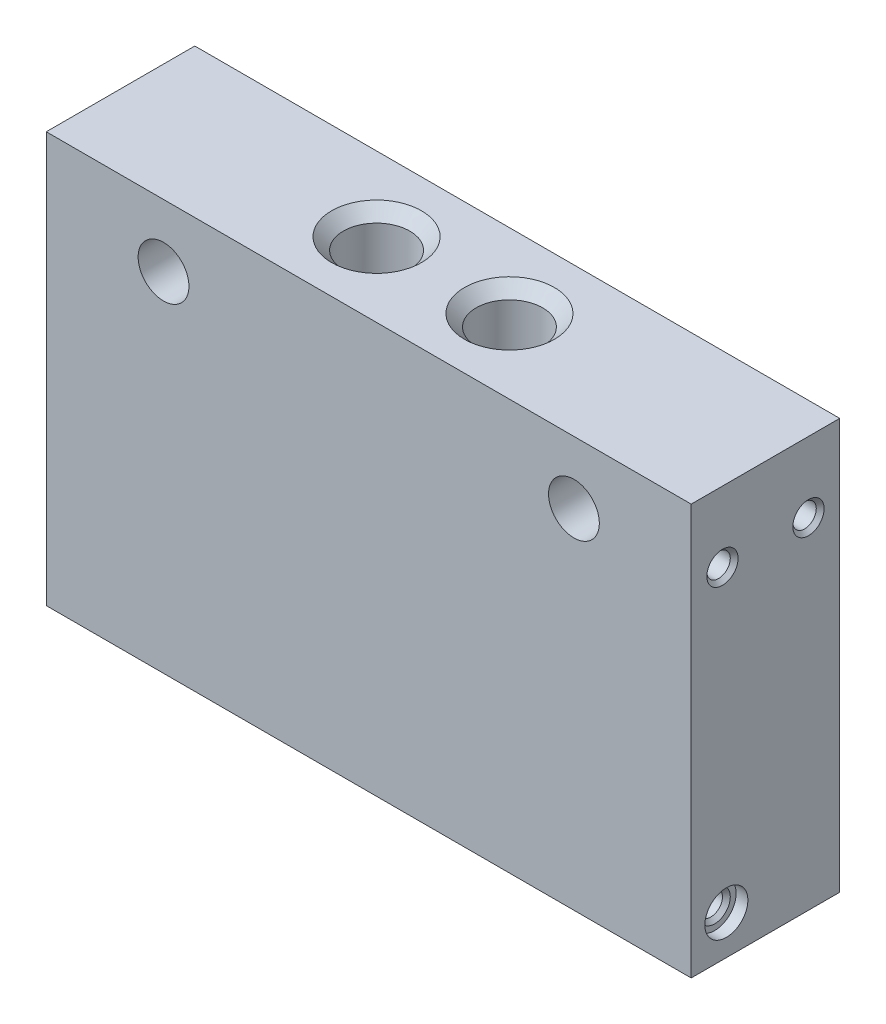
ISO-10303-21;
HEADER;
FILE_DESCRIPTION(('STEP AP214'),'2;1');
FILE_NAME('part.step','',(''),(''),'','','');
FILE_SCHEMA(('AUTOMOTIVE_DESIGN { 1 0 10303 214 1 1 1 1 }'));
ENDSEC;
DATA;
#1=APPLICATION_CONTEXT('core data for automotive mechanical design processes');
#2=APPLICATION_PROTOCOL_DEFINITION('international standard','automotive_design',2000,#1);
#3=PRODUCT_CONTEXT('',#1,'mechanical');
#4=PRODUCT('Part','Part','',(#3));
#5=PRODUCT_RELATED_PRODUCT_CATEGORY('part','',(#4));
#6=PRODUCT_DEFINITION_FORMATION('','',#4);
#7=PRODUCT_DEFINITION_CONTEXT('part definition',#1,'design');
#8=PRODUCT_DEFINITION('design','',#6,#7);
#9=PRODUCT_DEFINITION_SHAPE('','',#8);
#10=(LENGTH_UNIT() NAMED_UNIT(*) SI_UNIT(.MILLI.,.METRE.));
#11=(NAMED_UNIT(*) PLANE_ANGLE_UNIT() SI_UNIT($,.RADIAN.));
#12=(NAMED_UNIT(*) SI_UNIT($,.STERADIAN.) SOLID_ANGLE_UNIT());
#13=UNCERTAINTY_MEASURE_WITH_UNIT(LENGTH_MEASURE(1.E-05),#10,'distance_accuracy_value','');
#14=(GEOMETRIC_REPRESENTATION_CONTEXT(3) GLOBAL_UNCERTAINTY_ASSIGNED_CONTEXT((#13)) GLOBAL_UNIT_ASSIGNED_CONTEXT((#10,
#11,#12)) REPRESENTATION_CONTEXT('',''));
#15=CARTESIAN_POINT('',(0.,0.,0.));
#16=DIRECTION('',(0.,0.,1.));
#17=DIRECTION('',(1.,0.,0.));
#18=AXIS2_PLACEMENT_3D('',#15,#16,#17);
#19=CARTESIAN_POINT('',(41.91,26.67,-9.652));
#20=DIRECTION('',(-1.,0.,0.));
#21=DIRECTION('',(0.,0.,1.));
#22=AXIS2_PLACEMENT_3D('',#19,#20,#21);
#23=PLANE('',#22);
#24=CARTESIAN_POINT('',(41.91,22.098,-7.61999999999999));
#25=DIRECTION('',(-1.,0.,0.));
#26=DIRECTION('',(0.,0.,1.));
#27=AXIS2_PLACEMENT_3D('',#24,#25,#26);
#28=CIRCLE('',#27,1.016);
#29=CARTESIAN_POINT('',(41.91,22.098,-6.60399999999999));
#30=VERTEX_POINT('',#29);
#31=EDGE_CURVE('E163',#30,#30,#28,.T.);
#32=ORIENTED_EDGE('',*,*,#31,.T.);
#33=EDGE_LOOP('',(#32));
#34=FACE_BOUND('',#33,.T.);
#35=CARTESIAN_POINT('',(41.91,2.54,-2.286));
#36=DIRECTION('',(1.,0.,0.));
#37=DIRECTION('',(0.,0.,-1.));
#38=AXIS2_PLACEMENT_3D('',#35,#36,#37);
#39=CIRCLE('',#38,1.397);
#40=CARTESIAN_POINT('',(41.91,2.54,-3.683));
#41=VERTEX_POINT('',#40);
#42=EDGE_CURVE('E195',#41,#41,#39,.T.);
#43=ORIENTED_EDGE('',*,*,#42,.F.);
#44=EDGE_LOOP('',(#43));
#45=FACE_BOUND('',#44,.T.);
#46=DIRECTION('',(0.,0.,-1.));
#47=VECTOR('',#46,1.);
#48=CARTESIAN_POINT('',(41.91,0.,-9.652));
#49=LINE('',#48,#47);
#50=CARTESIAN_POINT('',(41.91,0.,0.));
#51=VERTEX_POINT('',#50);
#52=CARTESIAN_POINT('',(41.91,0.,-9.652));
#53=VERTEX_POINT('',#52);
#54=EDGE_CURVE('E71',#51,#53,#49,.T.);
#55=ORIENTED_EDGE('',*,*,#54,.T.);
#56=DIRECTION('',(0.,-1.,0.));
#57=VECTOR('',#56,1.);
#58=CARTESIAN_POINT('',(41.91,26.67,-9.652));
#59=LINE('',#58,#57);
#60=CARTESIAN_POINT('',(41.91,26.67,-9.652));
#61=VERTEX_POINT('',#60);
#62=EDGE_CURVE('E97',#61,#53,#59,.T.);
#63=ORIENTED_EDGE('',*,*,#62,.F.);
#64=DIRECTION('',(0.,0.,-1.));
#65=VECTOR('',#64,1.);
#66=CARTESIAN_POINT('',(41.91,26.67,-9.652));
#67=LINE('',#66,#65);
#68=CARTESIAN_POINT('',(41.91,26.67,0.));
#69=VERTEX_POINT('',#68);
#70=EDGE_CURVE('E88',#69,#61,#67,.T.);
#71=ORIENTED_EDGE('',*,*,#70,.F.);
#72=DIRECTION('',(0.,-1.,0.));
#73=VECTOR('',#72,1.);
#74=CARTESIAN_POINT('',(41.91,26.67,0.));
#75=LINE('',#74,#73);
#76=EDGE_CURVE('E93',#69,#51,#75,.T.);
#77=ORIENTED_EDGE('',*,*,#76,.T.);
#78=EDGE_LOOP('',(#55,#63,#71,#77));
#79=FACE_BOUND('',#78,.T.);
#80=CARTESIAN_POINT('',(41.91,22.098,-2.032));
#81=DIRECTION('',(-1.,0.,0.));
#82=DIRECTION('',(0.,0.,1.));
#83=AXIS2_PLACEMENT_3D('',#80,#81,#82);
#84=CIRCLE('',#83,1.016);
#85=CARTESIAN_POINT('',(41.91,22.098,-1.016));
#86=VERTEX_POINT('',#85);
#87=EDGE_CURVE('E174',#86,#86,#84,.T.);
#88=ORIENTED_EDGE('',*,*,#87,.T.);
#89=EDGE_LOOP('',(#88));
#90=FACE_BOUND('',#89,.T.);
#91=ADVANCED_FACE('F35',(#34,#45,#79,#90),#23,.F.);
#92=CARTESIAN_POINT('',(0.,26.67,-9.65199999999999));
#93=DIRECTION('',(1.,0.,0.));
#94=DIRECTION('',(0.,0.,-1.));
#95=AXIS2_PLACEMENT_3D('',#92,#93,#94);
#96=PLANE('',#95);
#97=CARTESIAN_POINT('',(0.,22.098,-2.032));
#98=DIRECTION('',(-1.,0.,0.));
#99=DIRECTION('',(0.,0.,1.));
#100=AXIS2_PLACEMENT_3D('',#97,#98,#99);
#101=CIRCLE('',#100,1.016);
#102=CARTESIAN_POINT('',(0.,22.098,-1.016));
#103=VERTEX_POINT('',#102);
#104=EDGE_CURVE('E159',#103,#103,#101,.T.);
#105=ORIENTED_EDGE('',*,*,#104,.F.);
#106=EDGE_LOOP('',(#105));
#107=FACE_BOUND('',#106,.T.);
#108=CARTESIAN_POINT('',(0.,22.098,-7.61999999999999));
#109=DIRECTION('',(-1.,0.,0.));
#110=DIRECTION('',(0.,0.,1.));
#111=AXIS2_PLACEMENT_3D('',#108,#109,#110);
#112=CIRCLE('',#111,1.016);
#113=CARTESIAN_POINT('',(0.,22.098,-6.60399999999999));
#114=VERTEX_POINT('',#113);
#115=EDGE_CURVE('E156',#114,#114,#112,.T.);
#116=ORIENTED_EDGE('',*,*,#115,.F.);
#117=EDGE_LOOP('',(#116));
#118=FACE_BOUND('',#117,.T.);
#119=DIRECTION('',(0.,0.,1.));
#120=VECTOR('',#119,1.);
#121=CARTESIAN_POINT('',(0.,0.,-9.65199999999999));
#122=LINE('',#121,#120);
#123=CARTESIAN_POINT('',(0.,0.,-9.65199999999999));
#124=VERTEX_POINT('',#123);
#125=CARTESIAN_POINT('',(0.,0.,0.));
#126=VERTEX_POINT('',#125);
#127=EDGE_CURVE('E105',#124,#126,#122,.T.);
#128=ORIENTED_EDGE('',*,*,#127,.T.);
#129=DIRECTION('',(0.,-1.,0.));
#130=VECTOR('',#129,1.);
#131=CARTESIAN_POINT('',(0.,26.67,0.));
#132=LINE('',#131,#130);
#133=CARTESIAN_POINT('',(0.,26.67,0.));
#134=VERTEX_POINT('',#133);
#135=EDGE_CURVE('E96',#134,#126,#132,.T.);
#136=ORIENTED_EDGE('',*,*,#135,.F.);
#137=DIRECTION('',(0.,0.,1.));
#138=VECTOR('',#137,1.);
#139=CARTESIAN_POINT('',(0.,26.67,-9.65199999999999));
#140=LINE('',#139,#138);
#141=CARTESIAN_POINT('',(0.,26.67,-9.65199999999999));
#142=VERTEX_POINT('',#141);
#143=EDGE_CURVE('E90',#142,#134,#140,.T.);
#144=ORIENTED_EDGE('',*,*,#143,.F.);
#145=DIRECTION('',(0.,-1.,0.));
#146=VECTOR('',#145,1.);
#147=CARTESIAN_POINT('',(0.,26.67,-9.65199999999999));
#148=LINE('',#147,#146);
#149=EDGE_CURVE('E101',#142,#124,#148,.T.);
#150=ORIENTED_EDGE('',*,*,#149,.T.);
#151=EDGE_LOOP('',(#128,#136,#144,#150));
#152=FACE_BOUND('',#151,.T.);
#153=CARTESIAN_POINT('',(0.,2.54,-2.286));
#154=DIRECTION('',(1.,0.,0.));
#155=DIRECTION('',(0.,0.,-1.));
#156=AXIS2_PLACEMENT_3D('',#153,#154,#155);
#157=CIRCLE('',#156,1.397);
#158=CARTESIAN_POINT('',(0.,2.54,-0.889));
#159=VERTEX_POINT('',#158);
#160=EDGE_CURVE('E188',#159,#159,#157,.T.);
#161=ORIENTED_EDGE('',*,*,#160,.T.);
#162=EDGE_LOOP('',(#161));
#163=FACE_BOUND('',#162,.T.);
#164=ADVANCED_FACE('F238',(#107,#118,#152,#163),#96,.F.);
#165=CARTESIAN_POINT('',(0.,26.67,0.));
#166=DIRECTION('',(0.,0.,-1.));
#167=DIRECTION('',(-1.,0.,0.));
#168=AXIS2_PLACEMENT_3D('',#165,#166,#167);
#169=PLANE('',#168);
#170=CARTESIAN_POINT('',(7.62,22.606,0.));
#171=DIRECTION('',(0.,0.,1.));
#172=DIRECTION('',(-1.,0.,0.));
#173=AXIS2_PLACEMENT_3D('',#170,#171,#172);
#174=CIRCLE('',#173,1.651);
#175=CARTESIAN_POINT('',(5.969,22.606,0.));
#176=VERTEX_POINT('',#175);
#177=EDGE_CURVE('E222',#176,#176,#174,.T.);
#178=ORIENTED_EDGE('',*,*,#177,.F.);
#179=EDGE_LOOP('',(#178));
#180=FACE_BOUND('',#179,.T.);
#181=CARTESIAN_POINT('',(34.29,22.606,0.));
#182=DIRECTION('',(0.,0.,1.));
#183=DIRECTION('',(1.,0.,0.));
#184=AXIS2_PLACEMENT_3D('',#181,#182,#183);
#185=CIRCLE('',#184,1.651);
#186=CARTESIAN_POINT('',(35.941,22.606,0.));
#187=VERTEX_POINT('',#186);
#188=EDGE_CURVE('E226',#187,#187,#185,.T.);
#189=ORIENTED_EDGE('',*,*,#188,.F.);
#190=EDGE_LOOP('',(#189));
#191=FACE_BOUND('',#190,.T.);
#192=DIRECTION('',(1.,0.,0.));
#193=VECTOR('',#192,1.);
#194=CARTESIAN_POINT('',(0.,0.,0.));
#195=LINE('',#194,#193);
#196=EDGE_CURVE('E95',#126,#51,#195,.T.);
#197=ORIENTED_EDGE('',*,*,#196,.T.);
#198=ORIENTED_EDGE('',*,*,#76,.F.);
#199=DIRECTION('',(1.,0.,0.));
#200=VECTOR('',#199,1.);
#201=CARTESIAN_POINT('',(0.,26.67,0.));
#202=LINE('',#201,#200);
#203=EDGE_CURVE('E85',#134,#69,#202,.T.);
#204=ORIENTED_EDGE('',*,*,#203,.F.);
#205=ORIENTED_EDGE('',*,*,#135,.T.);
#206=EDGE_LOOP('',(#197,#198,#204,#205));
#207=FACE_BOUND('',#206,.T.);
#208=ADVANCED_FACE('F94',(#180,#191,#207),#169,.F.);
#209=CARTESIAN_POINT('',(41.91,26.67,-9.652));
#210=DIRECTION('',(0.,0.,1.));
#211=DIRECTION('',(1.,0.,0.));
#212=AXIS2_PLACEMENT_3D('',#209,#210,#211);
#213=PLANE('',#212);
#214=CARTESIAN_POINT('',(7.62,22.606,-9.652));
#215=DIRECTION('',(0.,0.,1.));
#216=DIRECTION('',(-1.,0.,0.));
#217=AXIS2_PLACEMENT_3D('',#214,#215,#216);
#218=CIRCLE('',#217,1.651);
#219=CARTESIAN_POINT('',(5.969,22.606,-9.652));
#220=VERTEX_POINT('',#219);
#221=EDGE_CURVE('E223',#220,#220,#218,.T.);
#222=ORIENTED_EDGE('',*,*,#221,.T.);
#223=EDGE_LOOP('',(#222));
#224=FACE_BOUND('',#223,.T.);
#225=CARTESIAN_POINT('',(34.29,22.606,-9.652));
#226=DIRECTION('',(0.,0.,1.));
#227=DIRECTION('',(1.,0.,0.));
#228=AXIS2_PLACEMENT_3D('',#225,#226,#227);
#229=CIRCLE('',#228,1.651);
#230=CARTESIAN_POINT('',(35.941,22.606,-9.652));
#231=VERTEX_POINT('',#230);
#232=EDGE_CURVE('E108',#231,#231,#229,.T.);
#233=ORIENTED_EDGE('',*,*,#232,.T.);
#234=EDGE_LOOP('',(#233));
#235=FACE_BOUND('',#234,.T.);
#236=DIRECTION('',(-1.,0.,0.));
#237=VECTOR('',#236,1.);
#238=CARTESIAN_POINT('',(41.91,0.,-9.652));
#239=LINE('',#238,#237);
#240=EDGE_CURVE('E77',#53,#124,#239,.T.);
#241=ORIENTED_EDGE('',*,*,#240,.T.);
#242=ORIENTED_EDGE('',*,*,#149,.F.);
#243=DIRECTION('',(-1.,0.,0.));
#244=VECTOR('',#243,1.);
#245=CARTESIAN_POINT('',(41.91,26.67,-9.652));
#246=LINE('',#245,#244);
#247=EDGE_CURVE('E54',#61,#142,#246,.T.);
#248=ORIENTED_EDGE('',*,*,#247,.F.);
#249=ORIENTED_EDGE('',*,*,#62,.T.);
#250=EDGE_LOOP('',(#241,#242,#248,#249));
#251=FACE_BOUND('',#250,.T.);
#252=ADVANCED_FACE('F237',(#224,#235,#251),#213,.F.);
#253=CARTESIAN_POINT('',(0.,26.67,0.));
#254=DIRECTION('',(0.,1.,0.));
#255=DIRECTION('',(0.,0.,1.));
#256=AXIS2_PLACEMENT_3D('',#253,#254,#255);
#257=PLANE('',#256);
#258=CARTESIAN_POINT('',(25.273,26.67,-4.826));
#259=DIRECTION('',(0.,1.,0.));
#260=DIRECTION('',(0.,0.,1.));
#261=AXIS2_PLACEMENT_3D('',#258,#259,#260);
#262=CIRCLE('',#261,2.921);
#263=CARTESIAN_POINT('',(25.273,26.67,-1.905));
#264=VERTEX_POINT('',#263);
#265=EDGE_CURVE('E121',#264,#264,#262,.F.);
#266=ORIENTED_EDGE('',*,*,#265,.T.);
#267=EDGE_LOOP('',(#266));
#268=FACE_BOUND('',#267,.T.);
#269=CARTESIAN_POINT('',(16.637,26.67,-4.826));
#270=DIRECTION('',(0.,1.,0.));
#271=DIRECTION('',(0.,0.,1.));
#272=AXIS2_PLACEMENT_3D('',#269,#270,#271);
#273=CIRCLE('',#272,2.921);
#274=CARTESIAN_POINT('',(16.637,26.67,-1.905));
#275=VERTEX_POINT('',#274);
#276=EDGE_CURVE('E118',#275,#275,#273,.F.);
#277=ORIENTED_EDGE('',*,*,#276,.T.);
#278=EDGE_LOOP('',(#277));
#279=FACE_BOUND('',#278,.T.);
#280=ORIENTED_EDGE('',*,*,#143,.T.);
#281=ORIENTED_EDGE('',*,*,#203,.T.);
#282=ORIENTED_EDGE('',*,*,#70,.T.);
#283=ORIENTED_EDGE('',*,*,#247,.T.);
#284=EDGE_LOOP('',(#280,#281,#282,#283));
#285=FACE_BOUND('',#284,.T.);
#286=ADVANCED_FACE('F86',(#268,#279,#285),#257,.T.);
#287=CARTESIAN_POINT('',(0.,0.,0.));
#288=DIRECTION('',(0.,1.,0.));
#289=DIRECTION('',(0.,0.,1.));
#290=AXIS2_PLACEMENT_3D('',#287,#288,#289);
#291=PLANE('',#290);
#292=CARTESIAN_POINT('',(8.509,0.,-4.826));
#293=DIRECTION('',(0.,-1.,0.));
#294=DIRECTION('',(0.,0.,-1.));
#295=AXIS2_PLACEMENT_3D('',#292,#293,#294);
#296=CIRCLE('',#295,2.921);
#297=CARTESIAN_POINT('',(8.509,0.,-7.747));
#298=VERTEX_POINT('',#297);
#299=EDGE_CURVE('E139',#298,#298,#296,.T.);
#300=ORIENTED_EDGE('',*,*,#299,.F.);
#301=EDGE_LOOP('',(#300));
#302=FACE_BOUND('',#301,.T.);
#303=CARTESIAN_POINT('',(20.955,0.,-4.826));
#304=DIRECTION('',(0.,-1.,0.));
#305=DIRECTION('',(0.,0.,-1.));
#306=AXIS2_PLACEMENT_3D('',#303,#304,#305);
#307=CIRCLE('',#306,2.921);
#308=CARTESIAN_POINT('',(20.955,0.,-7.747));
#309=VERTEX_POINT('',#308);
#310=EDGE_CURVE('E135',#309,#309,#307,.T.);
#311=ORIENTED_EDGE('',*,*,#310,.F.);
#312=EDGE_LOOP('',(#311));
#313=FACE_BOUND('',#312,.T.);
#314=CARTESIAN_POINT('',(33.401,0.,-4.826));
#315=DIRECTION('',(0.,-1.,0.));
#316=DIRECTION('',(0.,0.,-1.));
#317=AXIS2_PLACEMENT_3D('',#314,#315,#316);
#318=CIRCLE('',#317,2.921);
#319=CARTESIAN_POINT('',(33.401,0.,-7.747));
#320=VERTEX_POINT('',#319);
#321=EDGE_CURVE('E131',#320,#320,#318,.T.);
#322=ORIENTED_EDGE('',*,*,#321,.F.);
#323=EDGE_LOOP('',(#322));
#324=FACE_BOUND('',#323,.T.);
#325=ORIENTED_EDGE('',*,*,#127,.F.);
#326=ORIENTED_EDGE('',*,*,#240,.F.);
#327=ORIENTED_EDGE('',*,*,#54,.F.);
#328=ORIENTED_EDGE('',*,*,#196,.F.);
#329=EDGE_LOOP('',(#325,#326,#327,#328));
#330=FACE_BOUND('',#329,.T.);
#331=ADVANCED_FACE('F256',(#302,#313,#324,#330),#291,.F.);
#332=CARTESIAN_POINT('',(34.29,22.606,-9.652));
#333=DIRECTION('',(0.,0.,1.));
#334=DIRECTION('',(1.,0.,0.));
#335=AXIS2_PLACEMENT_3D('',#332,#333,#334);
#336=CYLINDRICAL_SURFACE('',#335,1.651);
#337=ORIENTED_EDGE('',*,*,#232,.F.);
#338=EDGE_LOOP('',(#337));
#339=FACE_BOUND('',#338,.T.);
#340=ORIENTED_EDGE('',*,*,#188,.T.);
#341=EDGE_LOOP('',(#340));
#342=FACE_BOUND('',#341,.T.);
#343=ADVANCED_FACE('F234',(#339,#342),#336,.F.);
#344=CARTESIAN_POINT('',(7.62,22.606,-9.652));
#345=DIRECTION('',(0.,0.,1.));
#346=DIRECTION('',(1.,0.,0.));
#347=AXIS2_PLACEMENT_3D('',#344,#345,#346);
#348=CYLINDRICAL_SURFACE('',#347,1.651);
#349=ORIENTED_EDGE('',*,*,#221,.F.);
#350=EDGE_LOOP('',(#349));
#351=FACE_BOUND('',#350,.T.);
#352=ORIENTED_EDGE('',*,*,#177,.T.);
#353=EDGE_LOOP('',(#352));
#354=FACE_BOUND('',#353,.T.);
#355=ADVANCED_FACE('F265',(#351,#354),#348,.F.);
#356=CARTESIAN_POINT('',(25.273,20.32,-4.826));
#357=DIRECTION('',(0.,1.,0.));
#358=DIRECTION('',(0.,0.,1.));
#359=AXIS2_PLACEMENT_3D('',#356,#357,#358);
#360=CYLINDRICAL_SURFACE('',#359,2.159);
#361=CARTESIAN_POINT('',(25.273,25.908,-4.826));
#362=DIRECTION('',(0.,1.,0.));
#363=DIRECTION('',(0.,0.,1.));
#364=AXIS2_PLACEMENT_3D('',#361,#362,#363);
#365=CIRCLE('',#364,2.159);
#366=CARTESIAN_POINT('',(25.273,25.908,-2.667));
#367=VERTEX_POINT('',#366);
#368=EDGE_CURVE('E115',#367,#367,#365,.T.);
#369=ORIENTED_EDGE('',*,*,#368,.T.);
#370=EDGE_LOOP('',(#369));
#371=FACE_BOUND('',#370,.T.);
#372=CARTESIAN_POINT('',(25.273,20.32,-4.826));
#373=DIRECTION('',(0.,1.,0.));
#374=DIRECTION('',(0.,0.,1.));
#375=AXIS2_PLACEMENT_3D('',#372,#373,#374);
#376=CIRCLE('',#375,2.159);
#377=CARTESIAN_POINT('',(25.273,20.32,-2.667));
#378=VERTEX_POINT('',#377);
#379=EDGE_CURVE('E219',#378,#378,#376,.T.);
#380=ORIENTED_EDGE('',*,*,#379,.F.);
#381=EDGE_LOOP('',(#380));
#382=FACE_BOUND('',#381,.T.);
#383=ADVANCED_FACE('F269',(#371,#382),#360,.F.);
#384=CARTESIAN_POINT('',(25.273,20.32,-4.826));
#385=DIRECTION('',(0.,1.,0.));
#386=DIRECTION('',(0.,0.,1.));
#387=AXIS2_PLACEMENT_3D('',#384,#385,#386);
#388=PLANE('',#387);
#389=ORIENTED_EDGE('',*,*,#379,.T.);
#390=EDGE_LOOP('',(#389));
#391=FACE_BOUND('',#390,.T.);
#392=ADVANCED_FACE('F273',(#391),#388,.T.);
#393=CARTESIAN_POINT('',(16.637,20.32,-4.826));
#394=DIRECTION('',(0.,1.,0.));
#395=DIRECTION('',(0.,0.,1.));
#396=AXIS2_PLACEMENT_3D('',#393,#394,#395);
#397=CYLINDRICAL_SURFACE('',#396,2.159);
#398=CARTESIAN_POINT('',(16.637,25.908,-4.826));
#399=DIRECTION('',(0.,1.,0.));
#400=DIRECTION('',(0.,0.,1.));
#401=AXIS2_PLACEMENT_3D('',#398,#399,#400);
#402=CIRCLE('',#401,2.159);
#403=CARTESIAN_POINT('',(16.637,25.908,-2.667));
#404=VERTEX_POINT('',#403);
#405=EDGE_CURVE('E124',#404,#404,#402,.T.);
#406=ORIENTED_EDGE('',*,*,#405,.T.);
#407=EDGE_LOOP('',(#406));
#408=FACE_BOUND('',#407,.T.);
#409=CARTESIAN_POINT('',(16.637,20.32,-4.826));
#410=DIRECTION('',(0.,1.,0.));
#411=DIRECTION('',(0.,0.,-1.));
#412=AXIS2_PLACEMENT_3D('',#409,#410,#411);
#413=CIRCLE('',#412,2.159);
#414=CARTESIAN_POINT('',(16.637,20.32,-6.985));
#415=VERTEX_POINT('',#414);
#416=EDGE_CURVE('E216',#415,#415,#413,.T.);
#417=ORIENTED_EDGE('',*,*,#416,.F.);
#418=EDGE_LOOP('',(#417));
#419=FACE_BOUND('',#418,.T.);
#420=ADVANCED_FACE('F277',(#408,#419),#397,.F.);
#421=CARTESIAN_POINT('',(16.637,20.32,-4.826));
#422=DIRECTION('',(0.,-1.,0.));
#423=DIRECTION('',(0.,0.,-1.));
#424=AXIS2_PLACEMENT_3D('',#421,#422,#423);
#425=PLANE('',#424);
#426=ORIENTED_EDGE('',*,*,#416,.T.);
#427=EDGE_LOOP('',(#426));
#428=FACE_BOUND('',#427,.T.);
#429=ADVANCED_FACE('F281',(#428),#425,.F.);
#430=CARTESIAN_POINT('',(25.273,25.908,-4.826));
#431=DIRECTION('',(0.,1.,0.));
#432=DIRECTION('',(0.,0.,1.));
#433=AXIS2_PLACEMENT_3D('',#430,#431,#432);
#434=CONICAL_SURFACE('',#433,2.159,0.785398163397453);
#435=ORIENTED_EDGE('',*,*,#265,.F.);
#436=EDGE_LOOP('',(#435));
#437=FACE_BOUND('',#436,.T.);
#438=ORIENTED_EDGE('',*,*,#368,.F.);
#439=EDGE_LOOP('',(#438));
#440=FACE_BOUND('',#439,.T.);
#441=ADVANCED_FACE('F285',(#437,#440),#434,.F.);
#442=CARTESIAN_POINT('',(16.637,25.908,-4.826));
#443=DIRECTION('',(0.,1.,0.));
#444=DIRECTION('',(0.,0.,1.));
#445=AXIS2_PLACEMENT_3D('',#442,#443,#444);
#446=CONICAL_SURFACE('',#445,2.159,0.785398163397453);
#447=ORIENTED_EDGE('',*,*,#276,.F.);
#448=EDGE_LOOP('',(#447));
#449=FACE_BOUND('',#448,.T.);
#450=ORIENTED_EDGE('',*,*,#405,.F.);
#451=EDGE_LOOP('',(#450));
#452=FACE_BOUND('',#451,.T.);
#453=ADVANCED_FACE('F295',(#449,#452),#446,.F.);
#454=CARTESIAN_POINT('',(33.401,5.08,-4.826));
#455=DIRECTION('',(0.,-1.,0.));
#456=DIRECTION('',(0.,0.,-1.));
#457=AXIS2_PLACEMENT_3D('',#454,#455,#456);
#458=PLANE('',#457);
#459=CARTESIAN_POINT('',(33.401,5.08,-4.826));
#460=DIRECTION('',(0.,-1.,0.));
#461=DIRECTION('',(0.,0.,-1.));
#462=AXIS2_PLACEMENT_3D('',#459,#460,#461);
#463=CIRCLE('',#462,2.159);
#464=CARTESIAN_POINT('',(33.401,5.08,-6.985));
#465=VERTEX_POINT('',#464);
#466=EDGE_CURVE('E213',#465,#465,#463,.T.);
#467=ORIENTED_EDGE('',*,*,#466,.T.);
#468=EDGE_LOOP('',(#467));
#469=FACE_BOUND('',#468,.T.);
#470=ADVANCED_FACE('F291',(#469),#458,.T.);
#471=CARTESIAN_POINT('',(33.401,5.08,-4.826));
#472=DIRECTION('',(0.,-1.,0.));
#473=DIRECTION('',(0.,0.,-1.));
#474=AXIS2_PLACEMENT_3D('',#471,#472,#473);
#475=CYLINDRICAL_SURFACE('',#474,2.159);
#476=ORIENTED_EDGE('',*,*,#466,.F.);
#477=EDGE_LOOP('',(#476));
#478=FACE_BOUND('',#477,.T.);
#479=CARTESIAN_POINT('',(33.401,0.762,-4.826));
#480=DIRECTION('',(0.,-1.,0.));
#481=DIRECTION('',(0.,0.,-1.));
#482=AXIS2_PLACEMENT_3D('',#479,#480,#481);
#483=CIRCLE('',#482,2.159);
#484=CARTESIAN_POINT('',(33.401,0.762,-6.985));
#485=VERTEX_POINT('',#484);
#486=EDGE_CURVE('E127',#485,#485,#483,.F.);
#487=ORIENTED_EDGE('',*,*,#486,.F.);
#488=EDGE_LOOP('',(#487));
#489=FACE_BOUND('',#488,.T.);
#490=ADVANCED_FACE('F287',(#478,#489),#475,.F.);
#491=CARTESIAN_POINT('',(20.955,5.08,-4.826));
#492=DIRECTION('',(0.,-1.,0.));
#493=DIRECTION('',(0.,0.,-1.));
#494=AXIS2_PLACEMENT_3D('',#491,#492,#493);
#495=PLANE('',#494);
#496=CARTESIAN_POINT('',(20.955,5.08,-4.826));
#497=DIRECTION('',(0.,-1.,0.));
#498=DIRECTION('',(0.,0.,-1.));
#499=AXIS2_PLACEMENT_3D('',#496,#497,#498);
#500=CIRCLE('',#499,2.159);
#501=CARTESIAN_POINT('',(20.955,5.08,-6.985));
#502=VERTEX_POINT('',#501);
#503=EDGE_CURVE('E130',#502,#502,#500,.T.);
#504=ORIENTED_EDGE('',*,*,#503,.T.);
#505=EDGE_LOOP('',(#504));
#506=FACE_BOUND('',#505,.T.);
#507=ADVANCED_FACE('F290',(#506),#495,.T.);
#508=CARTESIAN_POINT('',(20.955,5.08,-4.826));
#509=DIRECTION('',(0.,-1.,0.));
#510=DIRECTION('',(0.,0.,-1.));
#511=AXIS2_PLACEMENT_3D('',#508,#509,#510);
#512=CYLINDRICAL_SURFACE('',#511,2.159);
#513=ORIENTED_EDGE('',*,*,#503,.F.);
#514=EDGE_LOOP('',(#513));
#515=FACE_BOUND('',#514,.T.);
#516=CARTESIAN_POINT('',(20.955,0.762,-4.826));
#517=DIRECTION('',(0.,-1.,0.));
#518=DIRECTION('',(0.,0.,-1.));
#519=AXIS2_PLACEMENT_3D('',#516,#517,#518);
#520=CIRCLE('',#519,2.159);
#521=CARTESIAN_POINT('',(20.955,0.762,-6.985));
#522=VERTEX_POINT('',#521);
#523=EDGE_CURVE('E132',#522,#522,#520,.F.);
#524=ORIENTED_EDGE('',*,*,#523,.F.);
#525=EDGE_LOOP('',(#524));
#526=FACE_BOUND('',#525,.T.);
#527=ADVANCED_FACE('F305',(#515,#526),#512,.F.);
#528=CARTESIAN_POINT('',(8.509,5.08,-4.826));
#529=DIRECTION('',(0.,1.,0.));
#530=DIRECTION('',(0.,0.,1.));
#531=AXIS2_PLACEMENT_3D('',#528,#529,#530);
#532=PLANE('',#531);
#533=CARTESIAN_POINT('',(8.509,5.08,-4.826));
#534=DIRECTION('',(0.,-1.,0.));
#535=DIRECTION('',(0.,0.,1.));
#536=AXIS2_PLACEMENT_3D('',#533,#534,#535);
#537=CIRCLE('',#536,2.159);
#538=CARTESIAN_POINT('',(8.509,5.08,-2.667));
#539=VERTEX_POINT('',#538);
#540=EDGE_CURVE('E210',#539,#539,#537,.T.);
#541=ORIENTED_EDGE('',*,*,#540,.T.);
#542=EDGE_LOOP('',(#541));
#543=FACE_BOUND('',#542,.T.);
#544=ADVANCED_FACE('F301',(#543),#532,.F.);
#545=CARTESIAN_POINT('',(8.509,5.08,-4.826));
#546=DIRECTION('',(0.,-1.,0.));
#547=DIRECTION('',(0.,0.,-1.));
#548=AXIS2_PLACEMENT_3D('',#545,#546,#547);
#549=CYLINDRICAL_SURFACE('',#548,2.159);
#550=ORIENTED_EDGE('',*,*,#540,.F.);
#551=EDGE_LOOP('',(#550));
#552=FACE_BOUND('',#551,.T.);
#553=CARTESIAN_POINT('',(8.509,0.762,-4.826));
#554=DIRECTION('',(0.,-1.,0.));
#555=DIRECTION('',(0.,0.,-1.));
#556=AXIS2_PLACEMENT_3D('',#553,#554,#555);
#557=CIRCLE('',#556,2.159);
#558=CARTESIAN_POINT('',(8.509,0.762,-6.985));
#559=VERTEX_POINT('',#558);
#560=EDGE_CURVE('E136',#559,#559,#557,.F.);
#561=ORIENTED_EDGE('',*,*,#560,.F.);
#562=EDGE_LOOP('',(#561));
#563=FACE_BOUND('',#562,.T.);
#564=ADVANCED_FACE('F297',(#552,#563),#549,.F.);
#565=CARTESIAN_POINT('',(8.509,0.762,-4.826));
#566=DIRECTION('',(0.,-1.,0.));
#567=DIRECTION('',(0.,0.,-1.));
#568=AXIS2_PLACEMENT_3D('',#565,#566,#567);
#569=CONICAL_SURFACE('',#568,2.15900000000001,0.78539816339745);
#570=ORIENTED_EDGE('',*,*,#299,.T.);
#571=EDGE_LOOP('',(#570));
#572=FACE_BOUND('',#571,.T.);
#573=ORIENTED_EDGE('',*,*,#560,.T.);
#574=EDGE_LOOP('',(#573));
#575=FACE_BOUND('',#574,.T.);
#576=ADVANCED_FACE('F300',(#572,#575),#569,.F.);
#577=CARTESIAN_POINT('',(20.955,0.762,-4.826));
#578=DIRECTION('',(0.,-1.,0.));
#579=DIRECTION('',(0.,0.,-1.));
#580=AXIS2_PLACEMENT_3D('',#577,#578,#579);
#581=CONICAL_SURFACE('',#580,2.15900000000001,0.78539816339745);
#582=ORIENTED_EDGE('',*,*,#310,.T.);
#583=EDGE_LOOP('',(#582));
#584=FACE_BOUND('',#583,.T.);
#585=ORIENTED_EDGE('',*,*,#523,.T.);
#586=EDGE_LOOP('',(#585));
#587=FACE_BOUND('',#586,.T.);
#588=ADVANCED_FACE('F556',(#584,#587),#581,.F.);
#589=CARTESIAN_POINT('',(33.401,0.762,-4.826));
#590=DIRECTION('',(0.,-1.,0.));
#591=DIRECTION('',(0.,0.,-1.));
#592=AXIS2_PLACEMENT_3D('',#589,#590,#591);
#593=CONICAL_SURFACE('',#592,2.15900000000001,0.78539816339745);
#594=ORIENTED_EDGE('',*,*,#321,.T.);
#595=EDGE_LOOP('',(#594));
#596=FACE_BOUND('',#595,.T.);
#597=ORIENTED_EDGE('',*,*,#486,.T.);
#598=EDGE_LOOP('',(#597));
#599=FACE_BOUND('',#598,.T.);
#600=ADVANCED_FACE('F329',(#596,#599),#593,.F.);
#601=CARTESIAN_POINT('',(41.148,2.54,-2.286));
#602=DIRECTION('',(1.,0.,0.));
#603=DIRECTION('',(0.,0.,-1.));
#604=AXIS2_PLACEMENT_3D('',#601,#602,#603);
#605=PLANE('',#604);
#606=CARTESIAN_POINT('',(41.148,2.54,-2.286));
#607=DIRECTION('',(1.,0.,0.));
#608=DIRECTION('',(0.,0.,-1.));
#609=AXIS2_PLACEMENT_3D('',#606,#607,#608);
#610=CIRCLE('',#609,1.397);
#611=CARTESIAN_POINT('',(41.148,2.54,-3.683));
#612=VERTEX_POINT('',#611);
#613=EDGE_CURVE('E144',#612,#612,#610,.T.);
#614=ORIENTED_EDGE('',*,*,#613,.T.);
#615=EDGE_LOOP('',(#614));
#616=FACE_BOUND('',#615,.T.);
#617=CARTESIAN_POINT('',(41.148,2.54,-2.286));
#618=DIRECTION('',(1.,0.,0.));
#619=DIRECTION('',(0.,0.,-1.));
#620=AXIS2_PLACEMENT_3D('',#617,#618,#619);
#621=CIRCLE('',#620,1.016);
#622=CARTESIAN_POINT('',(41.148,2.54,-3.302));
#623=VERTEX_POINT('',#622);
#624=EDGE_CURVE('E140',#623,#623,#621,.F.);
#625=ORIENTED_EDGE('',*,*,#624,.T.);
#626=EDGE_LOOP('',(#625));
#627=FACE_BOUND('',#626,.T.);
#628=ADVANCED_FACE('F325',(#616,#627),#605,.T.);
#629=CARTESIAN_POINT('',(41.148,2.54,-2.286));
#630=DIRECTION('',(1.,0.,0.));
#631=DIRECTION('',(0.,0.,-1.));
#632=AXIS2_PLACEMENT_3D('',#629,#630,#631);
#633=CYLINDRICAL_SURFACE('',#632,1.397);
#634=CARTESIAN_POINT('',(41.148,2.54,-3.683));
#635=CARTESIAN_POINT('',(41.1559375,2.54,-3.683));
#636=CARTESIAN_POINT('',(41.163875,2.54,-3.683));
#637=CARTESIAN_POINT('',(41.17975,2.54,-3.683));
#638=CARTESIAN_POINT('',(41.1876875,2.54,-3.683));
#639=CARTESIAN_POINT('',(41.2035625,2.54,-3.683));
#640=CARTESIAN_POINT('',(41.2115,2.54,-3.683));
#641=CARTESIAN_POINT('',(41.227375,2.54,-3.683));
#642=CARTESIAN_POINT('',(41.2353125,2.54,-3.683));
#643=CARTESIAN_POINT('',(41.2511875,2.54,-3.683));
#644=CARTESIAN_POINT('',(41.259125,2.54,-3.683));
#645=CARTESIAN_POINT('',(41.275,2.54,-3.683));
#646=CARTESIAN_POINT('',(41.2829375,2.54,-3.683));
#647=CARTESIAN_POINT('',(41.2988125,2.54,-3.683));
#648=CARTESIAN_POINT('',(41.30675,2.54,-3.683));
#649=CARTESIAN_POINT('',(41.322625,2.54,-3.683));
#650=CARTESIAN_POINT('',(41.3305625,2.54,-3.683));
#651=CARTESIAN_POINT('',(41.3464375,2.54,-3.683));
#652=CARTESIAN_POINT('',(41.354375,2.54,-3.683));
#653=CARTESIAN_POINT('',(41.37025,2.54,-3.683));
#654=CARTESIAN_POINT('',(41.3781875,2.54,-3.683));
#655=CARTESIAN_POINT('',(41.3940625,2.54,-3.683));
#656=CARTESIAN_POINT('',(41.402,2.54,-3.683));
#657=CARTESIAN_POINT('',(41.417875,2.54,-3.683));
#658=CARTESIAN_POINT('',(41.4258125,2.54,-3.683));
#659=CARTESIAN_POINT('',(41.4416875,2.54,-3.683));
#660=CARTESIAN_POINT('',(41.449625,2.54,-3.683));
#661=CARTESIAN_POINT('',(41.4655,2.54,-3.683));
#662=CARTESIAN_POINT('',(41.4734375,2.54,-3.683));
#663=CARTESIAN_POINT('',(41.4893125,2.54,-3.683));
#664=CARTESIAN_POINT('',(41.49725,2.54,-3.683));
#665=CARTESIAN_POINT('',(41.513125,2.54,-3.683));
#666=CARTESIAN_POINT('',(41.5210625,2.54,-3.683));
#667=CARTESIAN_POINT('',(41.5369375,2.54,-3.683));
#668=CARTESIAN_POINT('',(41.544875,2.54,-3.683));
#669=CARTESIAN_POINT('',(41.56075,2.54,-3.683));
#670=CARTESIAN_POINT('',(41.5686875,2.54,-3.683));
#671=CARTESIAN_POINT('',(41.5845625,2.54,-3.683));
#672=CARTESIAN_POINT('',(41.5925,2.54,-3.683));
#673=CARTESIAN_POINT('',(41.608375,2.54,-3.683));
#674=CARTESIAN_POINT('',(41.6163125,2.54,-3.683));
#675=CARTESIAN_POINT('',(41.6321875,2.54,-3.683));
#676=CARTESIAN_POINT('',(41.640125,2.54,-3.683));
#677=CARTESIAN_POINT('',(41.656,2.54,-3.683));
#678=CARTESIAN_POINT('',(41.6639375,2.54,-3.683));
#679=CARTESIAN_POINT('',(41.6798125,2.54,-3.683));
#680=CARTESIAN_POINT('',(41.68775,2.54,-3.683));
#681=CARTESIAN_POINT('',(41.703625,2.54,-3.683));
#682=CARTESIAN_POINT('',(41.7115625,2.54,-3.683));
#683=CARTESIAN_POINT('',(41.7274375,2.54,-3.683));
#684=CARTESIAN_POINT('',(41.735375,2.54,-3.683));
#685=CARTESIAN_POINT('',(41.75125,2.54,-3.683));
#686=CARTESIAN_POINT('',(41.7591875,2.54,-3.683));
#687=CARTESIAN_POINT('',(41.7750625,2.54,-3.683));
#688=CARTESIAN_POINT('',(41.783,2.54,-3.683));
#689=CARTESIAN_POINT('',(41.798875,2.54,-3.683));
#690=CARTESIAN_POINT('',(41.8068125,2.54,-3.683));
#691=CARTESIAN_POINT('',(41.8226875,2.54,-3.683));
#692=CARTESIAN_POINT('',(41.830625,2.54,-3.683));
#693=CARTESIAN_POINT('',(41.8465,2.54,-3.683));
#694=CARTESIAN_POINT('',(41.8544375,2.54,-3.683));
#695=CARTESIAN_POINT('',(41.8703125,2.54,-3.683));
#696=CARTESIAN_POINT('',(41.87825,2.54,-3.683));
#697=CARTESIAN_POINT('',(41.894125,2.54,-3.683));
#698=CARTESIAN_POINT('',(41.9020625,2.54,-3.683));
#699=CARTESIAN_POINT('',(41.91,2.54,-3.683));
#700=B_SPLINE_CURVE_WITH_KNOTS('',3,(#634,#635,#636,#637,#638,#639,#640,#641,#642,#643,#644,
#645,#646,#647,#648,#649,#650,#651,#652,#653,#654,#655,#656,#657,#658,#659,#660,#661,#662,#663,
#664,#665,#666,#667,#668,#669,#670,#671,#672,#673,#674,#675,#676,#677,#678,#679,#680,#681,#682,
#683,#684,#685,#686,#687,#688,#689,#690,#691,#692,#693,#694,#695,#696,#697,#698,#699),
.UNSPECIFIED.,.F.,.F.,(4,2,2,2,2,2,2,2,2,2,2,2,2,2,2,2,2,2,2,2,2,2,2,2,2,2,2,2,2,2,2,2,4),(0.,
0.0238124999999978,0.0476249999999956,0.0714374999999934,0.0952499999999981,0.119062499999996,
0.142874999999994,0.166687499999998,0.190499999999996,0.214312499999994,0.238124999999999,
0.261937499999997,0.285749999999994,0.309562499999999,0.333374999999997,0.357187499999995,
0.380999999999999,0.404812499999997,0.428624999999995,0.452437499999993,0.476249999999998,
0.500062499999995,0.523874999999993,0.547687499999998,0.571499999999996,0.595312499999993,
0.619124999999998,0.642937499999996,0.666749999999994,0.690562499999998,0.714374999999996,
0.738187499999994,0.761999999999999),.UNSPECIFIED.);
#701=EDGE_CURVE('BSEAM321',#612,#41,#700,.T.);
#702=ORIENTED_EDGE('',*,*,#613,.F.);
#703=ORIENTED_EDGE('',*,*,#42,.T.);
#704=ORIENTED_EDGE('',*,*,#701,.T.);
#705=ORIENTED_EDGE('',*,*,#701,.F.);
#706=EDGE_LOOP('',(#702,#704,#703,#705));
#707=FACE_BOUND('',#706,.T.);
#708=ADVANCED_FACE('F321',(#707),#633,.F.);
#709=CARTESIAN_POINT('',(36.576,2.54,-2.286));
#710=DIRECTION('',(1.,0.,0.));
#711=DIRECTION('',(0.,0.,-1.));
#712=AXIS2_PLACEMENT_3D('',#709,#710,#711);
#713=PLANE('',#712);
#714=CARTESIAN_POINT('',(36.576,2.54,-2.286));
#715=DIRECTION('',(1.,0.,0.));
#716=DIRECTION('',(0.,0.,-1.));
#717=AXIS2_PLACEMENT_3D('',#714,#715,#716);
#718=CIRCLE('',#717,0.762);
#719=CARTESIAN_POINT('',(36.576,2.54,-3.048));
#720=VERTEX_POINT('',#719);
#721=EDGE_CURVE('E143',#720,#720,#718,.T.);
#722=ORIENTED_EDGE('',*,*,#721,.T.);
#723=EDGE_LOOP('',(#722));
#724=FACE_BOUND('',#723,.T.);
#725=ADVANCED_FACE('F317',(#724),#713,.T.);
#726=CARTESIAN_POINT('',(36.576,2.54,-2.286));
#727=DIRECTION('',(1.,0.,0.));
#728=DIRECTION('',(0.,0.,-1.));
#729=AXIS2_PLACEMENT_3D('',#726,#727,#728);
#730=CYLINDRICAL_SURFACE('',#729,0.762);
#731=CARTESIAN_POINT('',(40.894,2.54,-2.286));
#732=DIRECTION('',(1.,0.,0.));
#733=DIRECTION('',(0.,0.,-1.));
#734=AXIS2_PLACEMENT_3D('',#731,#732,#733);
#735=CIRCLE('',#734,0.762);
#736=CARTESIAN_POINT('',(40.894,2.54,-3.048));
#737=VERTEX_POINT('',#736);
#738=EDGE_CURVE('E45',#737,#737,#735,.T.);
#739=ORIENTED_EDGE('',*,*,#738,.T.);
#740=EDGE_LOOP('',(#739));
#741=FACE_BOUND('',#740,.T.);
#742=ORIENTED_EDGE('',*,*,#721,.F.);
#743=EDGE_LOOP('',(#742));
#744=FACE_BOUND('',#743,.T.);
#745=ADVANCED_FACE('F313',(#741,#744),#730,.F.);
#746=CARTESIAN_POINT('',(40.64,2.54,-2.286));
#747=DIRECTION('',(1.,0.,0.));
#748=DIRECTION('',(0.,0.,-1.));
#749=AXIS2_PLACEMENT_3D('',#746,#747,#748);
#750=CONICAL_SURFACE('',#749,0.507999999999991,0.785398163397456);
#751=ORIENTED_EDGE('',*,*,#624,.F.);
#752=EDGE_LOOP('',(#751));
#753=FACE_BOUND('',#752,.T.);
#754=ORIENTED_EDGE('',*,*,#738,.F.);
#755=EDGE_LOOP('',(#754));
#756=FACE_BOUND('',#755,.T.);
#757=ADVANCED_FACE('F316',(#753,#756),#750,.F.);
#758=CARTESIAN_POINT('',(0.762,2.54,-2.286));
#759=DIRECTION('',(-1.,0.,0.));
#760=DIRECTION('',(0.,0.,1.));
#761=AXIS2_PLACEMENT_3D('',#758,#759,#760);
#762=CYLINDRICAL_SURFACE('',#761,1.397);
#763=CARTESIAN_POINT('',(0.762,2.54,-2.286));
#764=DIRECTION('',(1.,0.,0.));
#765=DIRECTION('',(0.,0.,-1.));
#766=AXIS2_PLACEMENT_3D('',#763,#764,#765);
#767=CIRCLE('',#766,1.397);
#768=CARTESIAN_POINT('',(0.762,2.54,-0.889));
#769=VERTEX_POINT('',#768);
#770=EDGE_CURVE('E150',#769,#769,#767,.T.);
#771=CARTESIAN_POINT('',(0.762,2.54,-0.889));
#772=CARTESIAN_POINT('',(0.7540625,2.54,-0.889));
#773=CARTESIAN_POINT('',(0.746125,2.54,-0.889));
#774=CARTESIAN_POINT('',(0.73025,2.54,-0.889));
#775=CARTESIAN_POINT('',(0.7223125,2.54,-0.889));
#776=CARTESIAN_POINT('',(0.7064375,2.54,-0.889));
#777=CARTESIAN_POINT('',(0.6985,2.54,-0.889));
#778=CARTESIAN_POINT('',(0.682625,2.54,-0.889));
#779=CARTESIAN_POINT('',(0.6746875,2.54,-0.889));
#780=CARTESIAN_POINT('',(0.6588125,2.54,-0.889));
#781=CARTESIAN_POINT('',(0.650875,2.54,-0.889));
#782=CARTESIAN_POINT('',(0.635,2.54,-0.889));
#783=CARTESIAN_POINT('',(0.6270625,2.54,-0.889));
#784=CARTESIAN_POINT('',(0.6111875,2.54,-0.889));
#785=CARTESIAN_POINT('',(0.60325,2.54,-0.889));
#786=CARTESIAN_POINT('',(0.587375,2.54,-0.889));
#787=CARTESIAN_POINT('',(0.5794375,2.54,-0.889));
#788=CARTESIAN_POINT('',(0.5635625,2.54,-0.889));
#789=CARTESIAN_POINT('',(0.555625,2.54,-0.889));
#790=CARTESIAN_POINT('',(0.53975,2.54,-0.889));
#791=CARTESIAN_POINT('',(0.5318125,2.54,-0.889));
#792=CARTESIAN_POINT('',(0.5159375,2.54,-0.889));
#793=CARTESIAN_POINT('',(0.508,2.54,-0.889));
#794=CARTESIAN_POINT('',(0.492125,2.54,-0.889));
#795=CARTESIAN_POINT('',(0.4841875,2.54,-0.889));
#796=CARTESIAN_POINT('',(0.4683125,2.54,-0.889));
#797=CARTESIAN_POINT('',(0.460375,2.54,-0.889));
#798=CARTESIAN_POINT('',(0.4445,2.54,-0.889));
#799=CARTESIAN_POINT('',(0.4365625,2.54,-0.889));
#800=CARTESIAN_POINT('',(0.4206875,2.54,-0.889));
#801=CARTESIAN_POINT('',(0.41275,2.54,-0.889));
#802=CARTESIAN_POINT('',(0.396875,2.54,-0.889));
#803=CARTESIAN_POINT('',(0.3889375,2.54,-0.889));
#804=CARTESIAN_POINT('',(0.3730625,2.54,-0.889));
#805=CARTESIAN_POINT('',(0.365125,2.54,-0.889));
#806=CARTESIAN_POINT('',(0.34925,2.54,-0.889));
#807=CARTESIAN_POINT('',(0.3413125,2.54,-0.889));
#808=CARTESIAN_POINT('',(0.3254375,2.54,-0.889));
#809=CARTESIAN_POINT('',(0.3175,2.54,-0.889));
#810=CARTESIAN_POINT('',(0.301625,2.54,-0.889));
#811=CARTESIAN_POINT('',(0.2936875,2.54,-0.889));
#812=CARTESIAN_POINT('',(0.2778125,2.54,-0.889));
#813=CARTESIAN_POINT('',(0.269875,2.54,-0.889));
#814=CARTESIAN_POINT('',(0.254,2.54,-0.889));
#815=CARTESIAN_POINT('',(0.2460625,2.54,-0.889));
#816=CARTESIAN_POINT('',(0.2301875,2.54,-0.889));
#817=CARTESIAN_POINT('',(0.22225,2.54,-0.889));
#818=CARTESIAN_POINT('',(0.206375,2.54,-0.889));
#819=CARTESIAN_POINT('',(0.1984375,2.54,-0.889));
#820=CARTESIAN_POINT('',(0.1825625,2.54,-0.889));
#821=CARTESIAN_POINT('',(0.174625,2.54,-0.889));
#822=CARTESIAN_POINT('',(0.15875,2.54,-0.889));
#823=CARTESIAN_POINT('',(0.1508125,2.54,-0.889));
#824=CARTESIAN_POINT('',(0.1349375,2.54,-0.889));
#825=CARTESIAN_POINT('',(0.127,2.54,-0.889));
#826=CARTESIAN_POINT('',(0.111125,2.54,-0.889));
#827=CARTESIAN_POINT('',(0.1031875,2.54,-0.889));
#828=CARTESIAN_POINT('',(0.0873125,2.54,-0.889));
#829=CARTESIAN_POINT('',(0.079375,2.54,-0.889));
#830=CARTESIAN_POINT('',(0.0635,2.54,-0.889));
#831=CARTESIAN_POINT('',(0.0555625,2.54,-0.889));
#832=CARTESIAN_POINT('',(0.0396875,2.54,-0.889));
#833=CARTESIAN_POINT('',(0.03175,2.54,-0.889));
#834=CARTESIAN_POINT('',(0.015875,2.54,-0.889));
#835=CARTESIAN_POINT('',(0.00793749999999999,2.54,-0.889));
#836=CARTESIAN_POINT('',(0.,2.54,-0.889));
#837=B_SPLINE_CURVE_WITH_KNOTS('',3,(#771,#772,#773,#774,#775,#776,#777,#778,#779,#780,#781,
#782,#783,#784,#785,#786,#787,#788,#789,#790,#791,#792,#793,#794,#795,#796,#797,#798,#799,#800,
#801,#802,#803,#804,#805,#806,#807,#808,#809,#810,#811,#812,#813,#814,#815,#816,#817,#818,#819,
#820,#821,#822,#823,#824,#825,#826,#827,#828,#829,#830,#831,#832,#833,#834,#835,#836),
.UNSPECIFIED.,.F.,.F.,(4,2,2,2,2,2,2,2,2,2,2,2,2,2,2,2,2,2,2,2,2,2,2,2,2,2,2,2,2,2,2,2,4),(0.,
0.0238125000000001,0.047625,0.0714375,0.0952500000000001,0.1190625,0.142875,0.1666875,0.1905,
0.2143125,0.238125,0.2619375,0.28575,0.3095625,0.333375,0.3571875,0.381,0.4048125,0.428625,
0.4524375,0.47625,0.5000625,0.523875,0.5476875,0.5715,0.5953125,0.619125,0.6429375,0.66675,
0.6905625,0.714375,0.7381875,0.762),.UNSPECIFIED.);
#838=EDGE_CURVE('BSEAM341',#769,#159,#837,.T.);
#839=ORIENTED_EDGE('',*,*,#770,.T.);
#840=ORIENTED_EDGE('',*,*,#160,.F.);
#841=ORIENTED_EDGE('',*,*,#838,.T.);
#842=ORIENTED_EDGE('',*,*,#838,.F.);
#843=EDGE_LOOP('',(#839,#841,#840,#842));
#844=FACE_BOUND('',#843,.T.);
#845=ADVANCED_FACE('F341',(#844),#762,.F.);
#846=CARTESIAN_POINT('',(0.762,2.54,-2.286));
#847=DIRECTION('',(-1.,0.,0.));
#848=DIRECTION('',(0.,0.,-1.));
#849=AXIS2_PLACEMENT_3D('',#846,#847,#848);
#850=PLANE('',#849);
#851=CARTESIAN_POINT('',(0.762,2.54,-2.286));
#852=DIRECTION('',(-1.,0.,0.));
#853=DIRECTION('',(0.,0.,1.));
#854=AXIS2_PLACEMENT_3D('',#851,#852,#853);
#855=CIRCLE('',#854,1.016);
#856=CARTESIAN_POINT('',(0.762,2.54,-1.27));
#857=VERTEX_POINT('',#856);
#858=EDGE_CURVE('E147',#857,#857,#855,.T.);
#859=ORIENTED_EDGE('',*,*,#858,.F.);
#860=EDGE_LOOP('',(#859));
#861=FACE_BOUND('',#860,.T.);
#862=ORIENTED_EDGE('',*,*,#770,.F.);
#863=EDGE_LOOP('',(#862));
#864=FACE_BOUND('',#863,.T.);
#865=ADVANCED_FACE('F339',(#861,#864),#850,.T.);
#866=CARTESIAN_POINT('',(5.334,2.54,-2.286));
#867=DIRECTION('',(-1.,0.,0.));
#868=DIRECTION('',(0.,0.,-1.));
#869=AXIS2_PLACEMENT_3D('',#866,#867,#868);
#870=PLANE('',#869);
#871=CARTESIAN_POINT('',(5.334,2.54,-2.286));
#872=DIRECTION('',(1.,0.,0.));
#873=DIRECTION('',(0.,0.,-1.));
#874=AXIS2_PLACEMENT_3D('',#871,#872,#873);
#875=CIRCLE('',#874,0.762);
#876=CARTESIAN_POINT('',(5.334,2.54,-3.048));
#877=VERTEX_POINT('',#876);
#878=EDGE_CURVE('E149',#877,#877,#875,.T.);
#879=ORIENTED_EDGE('',*,*,#878,.F.);
#880=EDGE_LOOP('',(#879));
#881=FACE_BOUND('',#880,.T.);
#882=ADVANCED_FACE('F335',(#881),#870,.T.);
#883=CARTESIAN_POINT('',(5.334,2.54,-2.286));
#884=DIRECTION('',(-1.,0.,0.));
#885=DIRECTION('',(0.,0.,1.));
#886=AXIS2_PLACEMENT_3D('',#883,#884,#885);
#887=CYLINDRICAL_SURFACE('',#886,0.762);
#888=CARTESIAN_POINT('',(1.01599999999999,2.54,-2.286));
#889=DIRECTION('',(-1.,0.,0.));
#890=DIRECTION('',(0.,0.,1.));
#891=AXIS2_PLACEMENT_3D('',#888,#889,#890);
#892=CIRCLE('',#891,0.762);
#893=CARTESIAN_POINT('',(1.01599999999999,2.54,-1.524));
#894=VERTEX_POINT('',#893);
#895=EDGE_CURVE('E11',#894,#894,#892,.T.);
#896=ORIENTED_EDGE('',*,*,#895,.T.);
#897=EDGE_LOOP('',(#896));
#898=FACE_BOUND('',#897,.T.);
#899=ORIENTED_EDGE('',*,*,#878,.T.);
#900=EDGE_LOOP('',(#899));
#901=FACE_BOUND('',#900,.T.);
#902=ADVANCED_FACE('F331',(#898,#901),#887,.F.);
#903=CARTESIAN_POINT('',(0.761999999999991,2.54,-2.286));
#904=DIRECTION('',(-1.,0.,0.));
#905=DIRECTION('',(0.,0.,1.));
#906=AXIS2_PLACEMENT_3D('',#903,#904,#905);
#907=CONICAL_SURFACE('',#906,1.016,0.785398163397443);
#908=ORIENTED_EDGE('',*,*,#895,.F.);
#909=EDGE_LOOP('',(#908));
#910=FACE_BOUND('',#909,.T.);
#911=ORIENTED_EDGE('',*,*,#858,.T.);
#912=EDGE_LOOP('',(#911));
#913=FACE_BOUND('',#912,.T.);
#914=ADVANCED_FACE('F334',(#910,#913),#907,.F.);
#915=CARTESIAN_POINT('',(4.572,22.098,-7.61999999999999));
#916=DIRECTION('',(1.,0.,0.));
#917=DIRECTION('',(0.,0.,-1.));
#918=AXIS2_PLACEMENT_3D('',#915,#916,#917);
#919=PLANE('',#918);
#920=CARTESIAN_POINT('',(4.572,22.098,-7.61999999999999));
#921=DIRECTION('',(-1.,0.,0.));
#922=DIRECTION('',(0.,0.,-1.));
#923=AXIS2_PLACEMENT_3D('',#920,#921,#922);
#924=CIRCLE('',#923,0.762);
#925=CARTESIAN_POINT('',(4.572,22.098,-8.38199999999999));
#926=VERTEX_POINT('',#925);
#927=EDGE_CURVE('E155',#926,#926,#924,.T.);
#928=ORIENTED_EDGE('',*,*,#927,.T.);
#929=EDGE_LOOP('',(#928));
#930=FACE_BOUND('',#929,.T.);
#931=ADVANCED_FACE('F360',(#930),#919,.F.);
#932=CARTESIAN_POINT('',(4.572,22.098,-7.61999999999999));
#933=DIRECTION('',(-1.,0.,0.));
#934=DIRECTION('',(0.,0.,1.));
#935=AXIS2_PLACEMENT_3D('',#932,#933,#934);
#936=CYLINDRICAL_SURFACE('',#935,0.762);
#937=ORIENTED_EDGE('',*,*,#927,.F.);
#938=EDGE_LOOP('',(#937));
#939=FACE_BOUND('',#938,.T.);
#940=CARTESIAN_POINT('',(0.254,22.098,-7.61999999999999));
#941=DIRECTION('',(-1.,0.,0.));
#942=DIRECTION('',(0.,0.,1.));
#943=AXIS2_PLACEMENT_3D('',#940,#941,#942);
#944=CIRCLE('',#943,0.762);
#945=CARTESIAN_POINT('',(0.254,22.098,-6.85799999999999));
#946=VERTEX_POINT('',#945);
#947=EDGE_CURVE('E152',#946,#946,#944,.F.);
#948=ORIENTED_EDGE('',*,*,#947,.F.);
#949=EDGE_LOOP('',(#948));
#950=FACE_BOUND('',#949,.T.);
#951=ADVANCED_FACE('F356',(#939,#950),#936,.F.);
#952=CARTESIAN_POINT('',(4.572,22.098,-2.032));
#953=DIRECTION('',(-1.,0.,0.));
#954=DIRECTION('',(0.,0.,1.));
#955=AXIS2_PLACEMENT_3D('',#952,#953,#954);
#956=PLANE('',#955);
#957=CARTESIAN_POINT('',(4.572,22.098,-2.032));
#958=DIRECTION('',(-1.,0.,0.));
#959=DIRECTION('',(0.,0.,1.));
#960=AXIS2_PLACEMENT_3D('',#957,#958,#959);
#961=CIRCLE('',#960,0.762);
#962=CARTESIAN_POINT('',(4.572,22.098,-1.27));
#963=VERTEX_POINT('',#962);
#964=EDGE_CURVE('E185',#963,#963,#961,.T.);
#965=ORIENTED_EDGE('',*,*,#964,.T.);
#966=EDGE_LOOP('',(#965));
#967=FACE_BOUND('',#966,.T.);
#968=ADVANCED_FACE('F352',(#967),#956,.T.);
#969=CARTESIAN_POINT('',(4.572,22.098,-2.032));
#970=DIRECTION('',(-1.,0.,0.));
#971=DIRECTION('',(0.,0.,1.));
#972=AXIS2_PLACEMENT_3D('',#969,#970,#971);
#973=CYLINDRICAL_SURFACE('',#972,0.762);
#974=ORIENTED_EDGE('',*,*,#964,.F.);
#975=EDGE_LOOP('',(#974));
#976=FACE_BOUND('',#975,.T.);
#977=CARTESIAN_POINT('',(0.254,22.098,-2.032));
#978=DIRECTION('',(-1.,0.,0.));
#979=DIRECTION('',(0.,0.,1.));
#980=AXIS2_PLACEMENT_3D('',#977,#978,#979);
#981=CIRCLE('',#980,0.762);
#982=CARTESIAN_POINT('',(0.254,22.098,-1.27));
#983=VERTEX_POINT('',#982);
#984=EDGE_CURVE('E157',#983,#983,#981,.F.);
#985=ORIENTED_EDGE('',*,*,#984,.F.);
#986=EDGE_LOOP('',(#985));
#987=FACE_BOUND('',#986,.T.);
#988=ADVANCED_FACE('F348',(#976,#987),#973,.F.);
#989=CARTESIAN_POINT('',(0.254,22.098,-2.032));
#990=DIRECTION('',(-1.,0.,0.));
#991=DIRECTION('',(0.,0.,1.));
#992=AXIS2_PLACEMENT_3D('',#989,#990,#991);
#993=CONICAL_SURFACE('',#992,0.762000000000006,0.785398163397455);
#994=ORIENTED_EDGE('',*,*,#104,.T.);
#995=EDGE_LOOP('',(#994));
#996=FACE_BOUND('',#995,.T.);
#997=ORIENTED_EDGE('',*,*,#984,.T.);
#998=EDGE_LOOP('',(#997));
#999=FACE_BOUND('',#998,.T.);
#1000=ADVANCED_FACE('F351',(#996,#999),#993,.F.);
#1001=CARTESIAN_POINT('',(0.254,22.098,-7.61999999999999));
#1002=DIRECTION('',(-1.,0.,0.));
#1003=DIRECTION('',(0.,0.,1.));
#1004=AXIS2_PLACEMENT_3D('',#1001,#1002,#1003);
#1005=CONICAL_SURFACE('',#1004,0.762000000000007,0.785398163397453);
#1006=ORIENTED_EDGE('',*,*,#115,.T.);
#1007=EDGE_LOOP('',(#1006));
#1008=FACE_BOUND('',#1007,.T.);
#1009=ORIENTED_EDGE('',*,*,#947,.T.);
#1010=EDGE_LOOP('',(#1009));
#1011=FACE_BOUND('',#1010,.T.);
#1012=ADVANCED_FACE('F380',(#1008,#1011),#1005,.F.);
#1013=CARTESIAN_POINT('',(37.338,22.098,-7.61999999999999));
#1014=DIRECTION('',(-1.,0.,0.));
#1015=DIRECTION('',(0.,0.,-1.));
#1016=AXIS2_PLACEMENT_3D('',#1013,#1014,#1015);
#1017=PLANE('',#1016);
#1018=CARTESIAN_POINT('',(37.338,22.098,-7.61999999999999));
#1019=DIRECTION('',(-1.,0.,0.));
#1020=DIRECTION('',(0.,0.,-1.));
#1021=AXIS2_PLACEMENT_3D('',#1018,#1019,#1020);
#1022=CIRCLE('',#1021,0.762);
#1023=CARTESIAN_POINT('',(37.338,22.098,-8.38199999999999));
#1024=VERTEX_POINT('',#1023);
#1025=EDGE_CURVE('E162',#1024,#1024,#1022,.T.);
#1026=ORIENTED_EDGE('',*,*,#1025,.F.);
#1027=EDGE_LOOP('',(#1026));
#1028=FACE_BOUND('',#1027,.T.);
#1029=ADVANCED_FACE('F377',(#1028),#1017,.F.);
#1030=CARTESIAN_POINT('',(37.338,22.098,-7.61999999999999));
#1031=DIRECTION('',(1.,0.,0.));
#1032=DIRECTION('',(0.,0.,-1.));
#1033=AXIS2_PLACEMENT_3D('',#1030,#1031,#1032);
#1034=CYLINDRICAL_SURFACE('',#1033,0.762);
#1035=ORIENTED_EDGE('',*,*,#1025,.T.);
#1036=EDGE_LOOP('',(#1035));
#1037=FACE_BOUND('',#1036,.T.);
#1038=CARTESIAN_POINT('',(41.656,22.098,-7.61999999999999));
#1039=DIRECTION('',(1.,0.,0.));
#1040=DIRECTION('',(0.,0.,-1.));
#1041=AXIS2_PLACEMENT_3D('',#1038,#1039,#1040);
#1042=CIRCLE('',#1041,0.762);
#1043=CARTESIAN_POINT('',(41.656,22.098,-8.38199999999999));
#1044=VERTEX_POINT('',#1043);
#1045=EDGE_CURVE('E160',#1044,#1044,#1042,.T.);
#1046=ORIENTED_EDGE('',*,*,#1045,.T.);
#1047=EDGE_LOOP('',(#1046));
#1048=FACE_BOUND('',#1047,.T.);
#1049=ADVANCED_FACE('F373',(#1037,#1048),#1034,.F.);
#1050=CARTESIAN_POINT('',(37.338,22.098,-2.032));
#1051=DIRECTION('',(1.,0.,0.));
#1052=DIRECTION('',(0.,0.,1.));
#1053=AXIS2_PLACEMENT_3D('',#1050,#1051,#1052);
#1054=PLANE('',#1053);
#1055=CARTESIAN_POINT('',(37.338,22.098,-2.032));
#1056=DIRECTION('',(-1.,0.,0.));
#1057=DIRECTION('',(0.,0.,1.));
#1058=AXIS2_PLACEMENT_3D('',#1055,#1056,#1057);
#1059=CIRCLE('',#1058,0.762);
#1060=CARTESIAN_POINT('',(37.338,22.098,-1.27));
#1061=VERTEX_POINT('',#1060);
#1062=EDGE_CURVE('E167',#1061,#1061,#1059,.T.);
#1063=ORIENTED_EDGE('',*,*,#1062,.F.);
#1064=EDGE_LOOP('',(#1063));
#1065=FACE_BOUND('',#1064,.T.);
#1066=ADVANCED_FACE('F369',(#1065),#1054,.T.);
#1067=CARTESIAN_POINT('',(37.338,22.098,-2.032));
#1068=DIRECTION('',(1.,0.,0.));
#1069=DIRECTION('',(0.,0.,-1.));
#1070=AXIS2_PLACEMENT_3D('',#1067,#1068,#1069);
#1071=CYLINDRICAL_SURFACE('',#1070,0.762);
#1072=ORIENTED_EDGE('',*,*,#1062,.T.);
#1073=EDGE_LOOP('',(#1072));
#1074=FACE_BOUND('',#1073,.T.);
#1075=CARTESIAN_POINT('',(41.656,22.098,-2.032));
#1076=DIRECTION('',(1.,0.,0.));
#1077=DIRECTION('',(0.,0.,-1.));
#1078=AXIS2_PLACEMENT_3D('',#1075,#1076,#1077);
#1079=CIRCLE('',#1078,0.762);
#1080=CARTESIAN_POINT('',(41.656,22.098,-2.794));
#1081=VERTEX_POINT('',#1080);
#1082=EDGE_CURVE('E39',#1081,#1081,#1079,.T.);
#1083=ORIENTED_EDGE('',*,*,#1082,.T.);
#1084=EDGE_LOOP('',(#1083));
#1085=FACE_BOUND('',#1084,.T.);
#1086=ADVANCED_FACE('F365',(#1074,#1085),#1071,.F.);
#1087=CARTESIAN_POINT('',(41.91,22.098,-2.032));
#1088=DIRECTION('',(1.,0.,0.));
#1089=DIRECTION('',(0.,0.,-1.));
#1090=AXIS2_PLACEMENT_3D('',#1087,#1088,#1089);
#1091=CONICAL_SURFACE('',#1090,1.016,0.785398163397444);
#1092=ORIENTED_EDGE('',*,*,#1082,.F.);
#1093=EDGE_LOOP('',(#1092));
#1094=FACE_BOUND('',#1093,.T.);
#1095=ORIENTED_EDGE('',*,*,#87,.F.);
#1096=EDGE_LOOP('',(#1095));
#1097=FACE_BOUND('',#1096,.T.);
#1098=ADVANCED_FACE('F368',(#1094,#1097),#1091,.F.);
#1099=CARTESIAN_POINT('',(41.91,22.098,-7.61999999999999));
#1100=DIRECTION('',(1.,0.,0.));
#1101=DIRECTION('',(0.,0.,-1.));
#1102=AXIS2_PLACEMENT_3D('',#1099,#1100,#1101);
#1103=CONICAL_SURFACE('',#1102,1.016,0.785398163397444);
#1104=ORIENTED_EDGE('',*,*,#1045,.F.);
#1105=EDGE_LOOP('',(#1104));
#1106=FACE_BOUND('',#1105,.T.);
#1107=ORIENTED_EDGE('',*,*,#31,.F.);
#1108=EDGE_LOOP('',(#1107));
#1109=FACE_BOUND('',#1108,.T.);
#1110=ADVANCED_FACE('F37',(#1106,#1109),#1103,.F.);
#1111=CLOSED_SHELL('',(#91,#164,#208,#252,#286,#331,#343,#355,#383,#392,#420,#429,#441,#453,
#470,#490,#507,#527,#544,#564,#576,#588,#600,#628,#708,#725,#745,#757,#845,#865,#882,#902,#914,
#931,#951,#968,#988,#1000,#1012,#1029,#1049,#1066,#1086,#1098,#1110));
#1112=MANIFOLD_SOLID_BREP('B2',#1111);
#1113=ADVANCED_BREP_SHAPE_REPRESENTATION('',(#18,#1112),#14);
#1114=SHAPE_DEFINITION_REPRESENTATION(#9,#1113);
ENDSEC;
END-ISO-10303-21;
